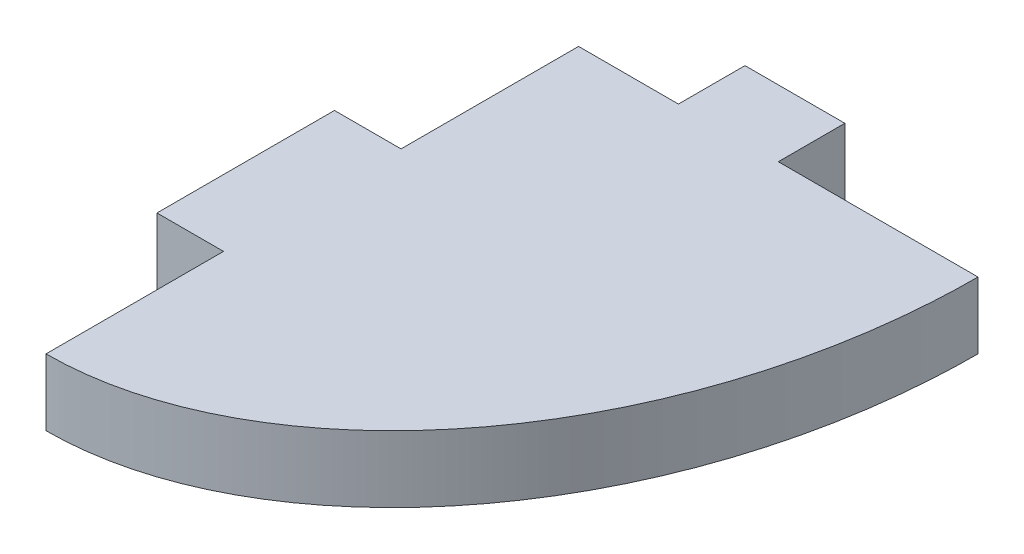
ISO-10303-21;
HEADER;
FILE_DESCRIPTION(('STEP AP214'),'2;1');
FILE_NAME('part.step','',(''),(''),'','','');
FILE_SCHEMA(('AUTOMOTIVE_DESIGN { 1 0 10303 214 1 1 1 1 }'));
ENDSEC;
DATA;
#1=APPLICATION_CONTEXT('core data for automotive mechanical design processes');
#2=APPLICATION_PROTOCOL_DEFINITION('international standard','automotive_design',2000,#1);
#3=PRODUCT_CONTEXT('',#1,'mechanical');
#4=PRODUCT('Part','Part','',(#3));
#5=PRODUCT_RELATED_PRODUCT_CATEGORY('part','',(#4));
#6=PRODUCT_DEFINITION_FORMATION('','',#4);
#7=PRODUCT_DEFINITION_CONTEXT('part definition',#1,'design');
#8=PRODUCT_DEFINITION('design','',#6,#7);
#9=PRODUCT_DEFINITION_SHAPE('','',#8);
#10=(LENGTH_UNIT() NAMED_UNIT(*) SI_UNIT(.MILLI.,.METRE.));
#11=(NAMED_UNIT(*) PLANE_ANGLE_UNIT() SI_UNIT($,.RADIAN.));
#12=(NAMED_UNIT(*) SI_UNIT($,.STERADIAN.) SOLID_ANGLE_UNIT());
#13=UNCERTAINTY_MEASURE_WITH_UNIT(LENGTH_MEASURE(1.E-05),#10,'distance_accuracy_value','');
#14=(GEOMETRIC_REPRESENTATION_CONTEXT(3) GLOBAL_UNCERTAINTY_ASSIGNED_CONTEXT((#13)) GLOBAL_UNIT_ASSIGNED_CONTEXT((#10,
#11,#12)) REPRESENTATION_CONTEXT('',''));
#15=CARTESIAN_POINT('',(0.,0.,0.));
#16=DIRECTION('',(0.,0.,1.));
#17=DIRECTION('',(1.,0.,0.));
#18=AXIS2_PLACEMENT_3D('',#15,#16,#17);
#19=CARTESIAN_POINT('',(0.,6.35,-33.8666667513333));
#20=DIRECTION('',(-1.,0.,0.));
#21=DIRECTION('',(0.,0.,1.));
#22=AXIS2_PLACEMENT_3D('',#19,#20,#21);
#23=PLANE('',#22);
#24=DIRECTION('',(0.,0.,-1.));
#25=VECTOR('',#24,1.);
#26=CARTESIAN_POINT('',(0.,0.,-33.8666667513333));
#27=LINE('',#26,#25);
#28=CARTESIAN_POINT('',(0.,0.,-33.8666667513333));
#29=VERTEX_POINT('',#28);
#30=CARTESIAN_POINT('',(0.,0.,-50.8000000846667));
#31=VERTEX_POINT('',#30);
#32=EDGE_CURVE('E148',#29,#31,#27,.T.);
#33=ORIENTED_EDGE('',*,*,#32,.F.);
#34=DIRECTION('',(0.,-1.,0.));
#35=VECTOR('',#34,1.);
#36=CARTESIAN_POINT('',(0.,6.35,-33.8666667513333));
#37=LINE('',#36,#35);
#38=CARTESIAN_POINT('',(0.,6.35,-33.8666667513333));
#39=VERTEX_POINT('',#38);
#40=EDGE_CURVE('E11',#39,#29,#37,.T.);
#41=ORIENTED_EDGE('',*,*,#40,.F.);
#42=DIRECTION('',(0.,0.,-1.));
#43=VECTOR('',#42,1.);
#44=CARTESIAN_POINT('',(0.,6.35,-33.8666667513333));
#45=LINE('',#44,#43);
#46=CARTESIAN_POINT('',(0.,6.35,-50.8000000846667));
#47=VERTEX_POINT('',#46);
#48=EDGE_CURVE('E177',#39,#47,#45,.T.);
#49=ORIENTED_EDGE('',*,*,#48,.T.);
#50=DIRECTION('',(0.,-1.,0.));
#51=VECTOR('',#50,1.);
#52=CARTESIAN_POINT('',(0.,6.35,-50.8000000846667));
#53=LINE('',#52,#51);
#54=EDGE_CURVE('E36',#47,#31,#53,.T.);
#55=ORIENTED_EDGE('',*,*,#54,.T.);
#56=EDGE_LOOP('',(#33,#41,#49,#55));
#57=FACE_BOUND('',#56,.T.);
#58=ADVANCED_FACE('F33',(#57),#23,.T.);
#59=CARTESIAN_POINT('',(-6.35,6.35,-33.8666667513333));
#60=DIRECTION('',(0.,0.,-1.));
#61=DIRECTION('',(-1.,0.,0.));
#62=AXIS2_PLACEMENT_3D('',#59,#60,#61);
#63=PLANE('',#62);
#64=DIRECTION('',(1.,0.,0.));
#65=VECTOR('',#64,1.);
#66=CARTESIAN_POINT('',(-6.35,0.,-33.8666667513333));
#67=LINE('',#66,#65);
#68=CARTESIAN_POINT('',(-6.35,0.,-33.8666667513333));
#69=VERTEX_POINT('',#68);
#70=EDGE_CURVE('E175',#69,#29,#67,.T.);
#71=ORIENTED_EDGE('',*,*,#70,.F.);
#72=DIRECTION('',(0.,-1.,0.));
#73=VECTOR('',#72,1.);
#74=CARTESIAN_POINT('',(-6.35,6.35,-33.8666667513333));
#75=LINE('',#74,#73);
#76=CARTESIAN_POINT('',(-6.35,6.35,-33.8666667513333));
#77=VERTEX_POINT('',#76);
#78=EDGE_CURVE('E42',#77,#69,#75,.T.);
#79=ORIENTED_EDGE('',*,*,#78,.F.);
#80=DIRECTION('',(1.,0.,0.));
#81=VECTOR('',#80,1.);
#82=CARTESIAN_POINT('',(-6.35,6.35,-33.8666667513333));
#83=LINE('',#82,#81);
#84=EDGE_CURVE('E138',#77,#39,#83,.T.);
#85=ORIENTED_EDGE('',*,*,#84,.T.);
#86=ORIENTED_EDGE('',*,*,#40,.T.);
#87=EDGE_LOOP('',(#71,#79,#85,#86));
#88=FACE_BOUND('',#87,.T.);
#89=ADVANCED_FACE('F195',(#88),#63,.T.);
#90=CARTESIAN_POINT('',(-6.35,6.35,-16.933333418));
#91=DIRECTION('',(-1.,0.,0.));
#92=DIRECTION('',(0.,0.,1.));
#93=AXIS2_PLACEMENT_3D('',#90,#91,#92);
#94=PLANE('',#93);
#95=DIRECTION('',(0.,0.,-1.));
#96=VECTOR('',#95,1.);
#97=CARTESIAN_POINT('',(-6.35,0.,-16.933333418));
#98=LINE('',#97,#96);
#99=CARTESIAN_POINT('',(-6.35,0.,-16.933333418));
#100=VERTEX_POINT('',#99);
#101=EDGE_CURVE('E125',#100,#69,#98,.T.);
#102=ORIENTED_EDGE('',*,*,#101,.F.);
#103=DIRECTION('',(0.,-1.,0.));
#104=VECTOR('',#103,1.);
#105=CARTESIAN_POINT('',(-6.35,6.35,-16.933333418));
#106=LINE('',#105,#104);
#107=CARTESIAN_POINT('',(-6.35,6.35,-16.933333418));
#108=VERTEX_POINT('',#107);
#109=EDGE_CURVE('E120',#108,#100,#106,.T.);
#110=ORIENTED_EDGE('',*,*,#109,.F.);
#111=DIRECTION('',(0.,0.,-1.));
#112=VECTOR('',#111,1.);
#113=CARTESIAN_POINT('',(-6.35,6.35,-16.933333418));
#114=LINE('',#113,#112);
#115=EDGE_CURVE('E123',#108,#77,#114,.T.);
#116=ORIENTED_EDGE('',*,*,#115,.T.);
#117=ORIENTED_EDGE('',*,*,#78,.T.);
#118=EDGE_LOOP('',(#102,#110,#116,#117));
#119=FACE_BOUND('',#118,.T.);
#120=ADVANCED_FACE('F122',(#119),#94,.T.);
#121=CARTESIAN_POINT('',(0.,6.35,-16.933333418));
#122=DIRECTION('',(0.,0.,1.));
#123=DIRECTION('',(1.,0.,0.));
#124=AXIS2_PLACEMENT_3D('',#121,#122,#123);
#125=PLANE('',#124);
#126=DIRECTION('',(-1.,0.,0.));
#127=VECTOR('',#126,1.);
#128=CARTESIAN_POINT('',(0.,0.,-16.933333418));
#129=LINE('',#128,#127);
#130=CARTESIAN_POINT('',(0.,0.,-16.933333418));
#131=VERTEX_POINT('',#130);
#132=EDGE_CURVE('E172',#131,#100,#129,.T.);
#133=ORIENTED_EDGE('',*,*,#132,.F.);
#134=DIRECTION('',(0.,-1.,0.));
#135=VECTOR('',#134,1.);
#136=CARTESIAN_POINT('',(0.,6.35,-16.933333418));
#137=LINE('',#136,#135);
#138=CARTESIAN_POINT('',(0.,6.35,-16.933333418));
#139=VERTEX_POINT('',#138);
#140=EDGE_CURVE('E130',#139,#131,#137,.T.);
#141=ORIENTED_EDGE('',*,*,#140,.F.);
#142=DIRECTION('',(-1.,0.,0.));
#143=VECTOR('',#142,1.);
#144=CARTESIAN_POINT('',(0.,6.35,-16.933333418));
#145=LINE('',#144,#143);
#146=EDGE_CURVE('E136',#139,#108,#145,.T.);
#147=ORIENTED_EDGE('',*,*,#146,.T.);
#148=ORIENTED_EDGE('',*,*,#109,.T.);
#149=EDGE_LOOP('',(#133,#141,#147,#148));
#150=FACE_BOUND('',#149,.T.);
#151=ADVANCED_FACE('F140',(#150),#125,.T.);
#152=CARTESIAN_POINT('',(0.,6.35,0.));
#153=DIRECTION('',(-1.,0.,0.));
#154=DIRECTION('',(0.,0.,1.));
#155=AXIS2_PLACEMENT_3D('',#152,#153,#154);
#156=PLANE('',#155);
#157=DIRECTION('',(0.,0.,-1.));
#158=VECTOR('',#157,1.);
#159=CARTESIAN_POINT('',(0.,0.,0.));
#160=LINE('',#159,#158);
#161=CARTESIAN_POINT('',(0.,0.,0.));
#162=VERTEX_POINT('',#161);
#163=EDGE_CURVE('E169',#162,#131,#160,.T.);
#164=ORIENTED_EDGE('',*,*,#163,.F.);
#165=DIRECTION('',(0.,-1.,0.));
#166=VECTOR('',#165,1.);
#167=CARTESIAN_POINT('',(0.,6.35,0.));
#168=LINE('',#167,#166);
#169=CARTESIAN_POINT('',(0.,6.35,0.));
#170=VERTEX_POINT('',#169);
#171=EDGE_CURVE('E181',#170,#162,#168,.T.);
#172=ORIENTED_EDGE('',*,*,#171,.F.);
#173=DIRECTION('',(0.,0.,-1.));
#174=VECTOR('',#173,1.);
#175=CARTESIAN_POINT('',(0.,6.35,0.));
#176=LINE('',#175,#174);
#177=EDGE_CURVE('E141',#170,#139,#176,.T.);
#178=ORIENTED_EDGE('',*,*,#177,.T.);
#179=ORIENTED_EDGE('',*,*,#140,.T.);
#180=EDGE_LOOP('',(#164,#172,#178,#179));
#181=FACE_BOUND('',#180,.T.);
#182=ADVANCED_FACE('F208',(#181),#156,.T.);
#183=CARTESIAN_POINT('',(0.,6.35,-50.8000000846667));
#184=DIRECTION('',(0.,1.,0.));
#185=DIRECTION('',(0.,0.,-1.));
#186=AXIS2_PLACEMENT_3D('',#183,#184,#185);
#187=ELLIPSE('',#186,50.8000000846667,38.1);
#188=DIRECTION('',(0.,-1.,0.));
#189=VECTOR('',#188,1.);
#190=SURFACE_OF_LINEAR_EXTRUSION('',#187,#189);
#191=CARTESIAN_POINT('',(0.,0.,-50.8000000846667));
#192=DIRECTION('',(0.,1.,0.));
#193=DIRECTION('',(0.,0.,-1.));
#194=AXIS2_PLACEMENT_3D('',#191,#192,#193);
#195=ELLIPSE('',#194,50.8000000846667,38.1);
#196=CARTESIAN_POINT('',(38.1,0.,-50.8000000846667));
#197=VERTEX_POINT('',#196);
#198=EDGE_CURVE('E166',#162,#197,#195,.T.);
#199=ORIENTED_EDGE('',*,*,#198,.T.);
#200=DIRECTION('',(0.,-1.,0.));
#201=VECTOR('',#200,1.);
#202=CARTESIAN_POINT('',(38.1,6.35,-50.8000000846667));
#203=LINE('',#202,#201);
#204=CARTESIAN_POINT('',(38.1,6.35,-50.8000000846667));
#205=VERTEX_POINT('',#204);
#206=EDGE_CURVE('E183',#205,#197,#203,.T.);
#207=ORIENTED_EDGE('',*,*,#206,.F.);
#208=EDGE_CURVE('E143',#170,#205,#187,.T.);
#209=ORIENTED_EDGE('',*,*,#208,.F.);
#210=ORIENTED_EDGE('',*,*,#171,.T.);
#211=EDGE_LOOP('',(#199,#207,#209,#210));
#212=FACE_BOUND('',#211,.T.);
#213=ADVANCED_FACE('F211',(#212),#190,.F.);
#214=CARTESIAN_POINT('',(19.05,6.35,-50.8000000846667));
#215=DIRECTION('',(0.,0.,-1.));
#216=DIRECTION('',(-1.,0.,0.));
#217=AXIS2_PLACEMENT_3D('',#214,#215,#216);
#218=PLANE('',#217);
#219=DIRECTION('',(1.,0.,0.));
#220=VECTOR('',#219,1.);
#221=CARTESIAN_POINT('',(19.05,0.,-50.8000000846667));
#222=LINE('',#221,#220);
#223=CARTESIAN_POINT('',(19.05,0.,-50.8000000846667));
#224=VERTEX_POINT('',#223);
#225=EDGE_CURVE('E163',#224,#197,#222,.T.);
#226=ORIENTED_EDGE('',*,*,#225,.F.);
#227=DIRECTION('',(0.,-1.,0.));
#228=VECTOR('',#227,1.);
#229=CARTESIAN_POINT('',(19.05,6.35,-50.8000000846667));
#230=LINE('',#229,#228);
#231=CARTESIAN_POINT('',(19.05,6.35,-50.8000000846667));
#232=VERTEX_POINT('',#231);
#233=EDGE_CURVE('E185',#232,#224,#230,.T.);
#234=ORIENTED_EDGE('',*,*,#233,.F.);
#235=DIRECTION('',(1.,0.,0.));
#236=VECTOR('',#235,1.);
#237=CARTESIAN_POINT('',(19.05,6.35,-50.8000000846667));
#238=LINE('',#237,#236);
#239=EDGE_CURVE('E220',#232,#205,#238,.T.);
#240=ORIENTED_EDGE('',*,*,#239,.T.);
#241=ORIENTED_EDGE('',*,*,#206,.T.);
#242=EDGE_LOOP('',(#226,#234,#240,#241));
#243=FACE_BOUND('',#242,.T.);
#244=ADVANCED_FACE('F215',(#243),#218,.T.);
#245=CARTESIAN_POINT('',(19.05,6.35,-57.1500000846667));
#246=DIRECTION('',(1.,0.,0.));
#247=DIRECTION('',(0.,0.,-1.));
#248=AXIS2_PLACEMENT_3D('',#245,#246,#247);
#249=PLANE('',#248);
#250=DIRECTION('',(0.,0.,1.));
#251=VECTOR('',#250,1.);
#252=CARTESIAN_POINT('',(19.05,0.,-57.1500000846667));
#253=LINE('',#252,#251);
#254=CARTESIAN_POINT('',(19.05,0.,-57.1500000846667));
#255=VERTEX_POINT('',#254);
#256=EDGE_CURVE('E160',#255,#224,#253,.T.);
#257=ORIENTED_EDGE('',*,*,#256,.F.);
#258=DIRECTION('',(0.,-1.,0.));
#259=VECTOR('',#258,1.);
#260=CARTESIAN_POINT('',(19.05,6.35,-57.1500000846667));
#261=LINE('',#260,#259);
#262=CARTESIAN_POINT('',(19.05,6.35,-57.1500000846667));
#263=VERTEX_POINT('',#262);
#264=EDGE_CURVE('E187',#263,#255,#261,.T.);
#265=ORIENTED_EDGE('',*,*,#264,.F.);
#266=DIRECTION('',(0.,0.,1.));
#267=VECTOR('',#266,1.);
#268=CARTESIAN_POINT('',(19.05,6.35,-57.1500000846667));
#269=LINE('',#268,#267);
#270=EDGE_CURVE('E223',#263,#232,#269,.T.);
#271=ORIENTED_EDGE('',*,*,#270,.T.);
#272=ORIENTED_EDGE('',*,*,#233,.T.);
#273=EDGE_LOOP('',(#257,#265,#271,#272));
#274=FACE_BOUND('',#273,.T.);
#275=ADVANCED_FACE('F244',(#274),#249,.T.);
#276=CARTESIAN_POINT('',(9.525,6.35,-57.1500000846667));
#277=DIRECTION('',(0.,0.,-1.));
#278=DIRECTION('',(-1.,0.,0.));
#279=AXIS2_PLACEMENT_3D('',#276,#277,#278);
#280=PLANE('',#279);
#281=DIRECTION('',(1.,0.,0.));
#282=VECTOR('',#281,1.);
#283=CARTESIAN_POINT('',(9.525,0.,-57.1500000846667));
#284=LINE('',#283,#282);
#285=CARTESIAN_POINT('',(9.525,0.,-57.1500000846667));
#286=VERTEX_POINT('',#285);
#287=EDGE_CURVE('E157',#286,#255,#284,.T.);
#288=ORIENTED_EDGE('',*,*,#287,.F.);
#289=DIRECTION('',(0.,-1.,0.));
#290=VECTOR('',#289,1.);
#291=CARTESIAN_POINT('',(9.525,6.35,-57.1500000846667));
#292=LINE('',#291,#290);
#293=CARTESIAN_POINT('',(9.525,6.35,-57.1500000846667));
#294=VERTEX_POINT('',#293);
#295=EDGE_CURVE('E189',#294,#286,#292,.T.);
#296=ORIENTED_EDGE('',*,*,#295,.F.);
#297=DIRECTION('',(1.,0.,0.));
#298=VECTOR('',#297,1.);
#299=CARTESIAN_POINT('',(9.525,6.35,-57.1500000846667));
#300=LINE('',#299,#298);
#301=EDGE_CURVE('E226',#294,#263,#300,.T.);
#302=ORIENTED_EDGE('',*,*,#301,.T.);
#303=ORIENTED_EDGE('',*,*,#264,.T.);
#304=EDGE_LOOP('',(#288,#296,#302,#303));
#305=FACE_BOUND('',#304,.T.);
#306=ADVANCED_FACE('F242',(#305),#280,.T.);
#307=CARTESIAN_POINT('',(9.525,6.35,-50.8000000846667));
#308=DIRECTION('',(-1.,0.,0.));
#309=DIRECTION('',(0.,0.,1.));
#310=AXIS2_PLACEMENT_3D('',#307,#308,#309);
#311=PLANE('',#310);
#312=DIRECTION('',(0.,0.,-1.));
#313=VECTOR('',#312,1.);
#314=CARTESIAN_POINT('',(9.525,0.,-50.8000000846667));
#315=LINE('',#314,#313);
#316=CARTESIAN_POINT('',(9.525,0.,-50.8000000846667));
#317=VERTEX_POINT('',#316);
#318=EDGE_CURVE('E154',#317,#286,#315,.T.);
#319=ORIENTED_EDGE('',*,*,#318,.F.);
#320=DIRECTION('',(0.,-1.,0.));
#321=VECTOR('',#320,1.);
#322=CARTESIAN_POINT('',(9.525,6.35,-50.8000000846667));
#323=LINE('',#322,#321);
#324=CARTESIAN_POINT('',(9.525,6.35,-50.8000000846667));
#325=VERTEX_POINT('',#324);
#326=EDGE_CURVE('E190',#325,#317,#323,.T.);
#327=ORIENTED_EDGE('',*,*,#326,.F.);
#328=DIRECTION('',(0.,0.,-1.));
#329=VECTOR('',#328,1.);
#330=CARTESIAN_POINT('',(9.525,6.35,-50.8000000846667));
#331=LINE('',#330,#329);
#332=EDGE_CURVE('E229',#325,#294,#331,.T.);
#333=ORIENTED_EDGE('',*,*,#332,.T.);
#334=ORIENTED_EDGE('',*,*,#295,.T.);
#335=EDGE_LOOP('',(#319,#327,#333,#334));
#336=FACE_BOUND('',#335,.T.);
#337=ADVANCED_FACE('F238',(#336),#311,.T.);
#338=CARTESIAN_POINT('',(0.,6.35,-50.8000000846667));
#339=DIRECTION('',(0.,0.,-1.));
#340=DIRECTION('',(-1.,0.,0.));
#341=AXIS2_PLACEMENT_3D('',#338,#339,#340);
#342=PLANE('',#341);
#343=DIRECTION('',(1.,0.,0.));
#344=VECTOR('',#343,1.);
#345=CARTESIAN_POINT('',(0.,0.,-50.8000000846667));
#346=LINE('',#345,#344);
#347=EDGE_CURVE('E151',#31,#317,#346,.T.);
#348=ORIENTED_EDGE('',*,*,#347,.F.);
#349=ORIENTED_EDGE('',*,*,#54,.F.);
#350=DIRECTION('',(1.,0.,0.));
#351=VECTOR('',#350,1.);
#352=CARTESIAN_POINT('',(0.,6.35,-50.8000000846667));
#353=LINE('',#352,#351);
#354=EDGE_CURVE('E232',#47,#325,#353,.T.);
#355=ORIENTED_EDGE('',*,*,#354,.T.);
#356=ORIENTED_EDGE('',*,*,#326,.T.);
#357=EDGE_LOOP('',(#348,#349,#355,#356));
#358=FACE_BOUND('',#357,.T.);
#359=ADVANCED_FACE('F192',(#358),#342,.T.);
#360=CARTESIAN_POINT('',(0.,6.35,-50.8000000846667));
#361=DIRECTION('',(0.,1.,0.));
#362=DIRECTION('',(0.,0.,1.));
#363=AXIS2_PLACEMENT_3D('',#360,#361,#362);
#364=PLANE('',#363);
#365=ORIENTED_EDGE('',*,*,#48,.F.);
#366=ORIENTED_EDGE('',*,*,#84,.F.);
#367=ORIENTED_EDGE('',*,*,#115,.F.);
#368=ORIENTED_EDGE('',*,*,#146,.F.);
#369=ORIENTED_EDGE('',*,*,#177,.F.);
#370=ORIENTED_EDGE('',*,*,#208,.T.);
#371=ORIENTED_EDGE('',*,*,#239,.F.);
#372=ORIENTED_EDGE('',*,*,#270,.F.);
#373=ORIENTED_EDGE('',*,*,#301,.F.);
#374=ORIENTED_EDGE('',*,*,#332,.F.);
#375=ORIENTED_EDGE('',*,*,#354,.F.);
#376=EDGE_LOOP('',(#365,#366,#367,#368,#369,#370,#371,#372,#373,#374,#375));
#377=FACE_BOUND('',#376,.T.);
#378=ADVANCED_FACE('F134',(#377),#364,.T.);
#379=CARTESIAN_POINT('',(0.,0.,-50.8000000846667));
#380=DIRECTION('',(0.,1.,0.));
#381=DIRECTION('',(0.,0.,1.));
#382=AXIS2_PLACEMENT_3D('',#379,#380,#381);
#383=PLANE('',#382);
#384=ORIENTED_EDGE('',*,*,#32,.T.);
#385=ORIENTED_EDGE('',*,*,#347,.T.);
#386=ORIENTED_EDGE('',*,*,#318,.T.);
#387=ORIENTED_EDGE('',*,*,#287,.T.);
#388=ORIENTED_EDGE('',*,*,#256,.T.);
#389=ORIENTED_EDGE('',*,*,#225,.T.);
#390=ORIENTED_EDGE('',*,*,#198,.F.);
#391=ORIENTED_EDGE('',*,*,#163,.T.);
#392=ORIENTED_EDGE('',*,*,#132,.T.);
#393=ORIENTED_EDGE('',*,*,#101,.T.);
#394=ORIENTED_EDGE('',*,*,#70,.T.);
#395=EDGE_LOOP('',(#384,#385,#386,#387,#388,#389,#390,#391,#392,#393,#394));
#396=FACE_BOUND('',#395,.T.);
#397=ADVANCED_FACE('F194',(#396),#383,.F.);
#398=CLOSED_SHELL('',(#58,#89,#120,#151,#182,#213,#244,#275,#306,#337,#359,#378,#397));
#399=MANIFOLD_SOLID_BREP('B2',#398);
#400=ADVANCED_BREP_SHAPE_REPRESENTATION('',(#18,#399),#14);
#401=SHAPE_DEFINITION_REPRESENTATION(#9,#400);
ENDSEC;
END-ISO-10303-21;
